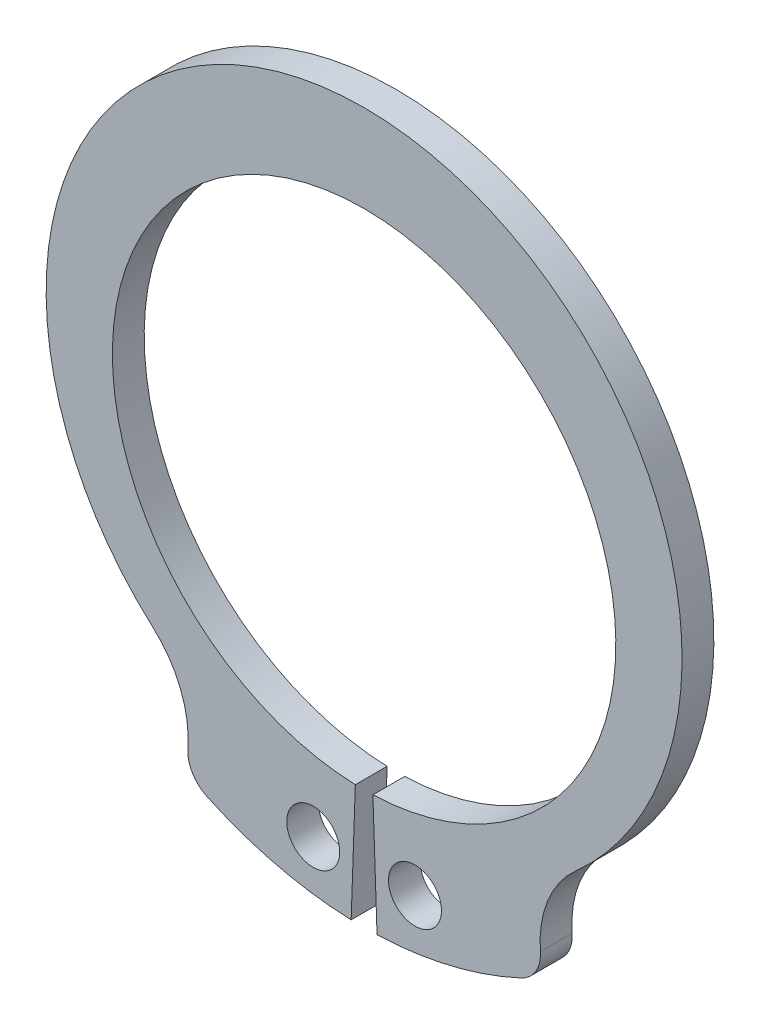
ISO-10303-21;
HEADER;
FILE_DESCRIPTION(('STEP AP214'),'2;1');
FILE_NAME('part.step','',(''),(''),'','','');
FILE_SCHEMA(('AUTOMOTIVE_DESIGN { 1 0 10303 214 1 1 1 1 }'));
ENDSEC;
DATA;
#1=APPLICATION_CONTEXT('core data for automotive mechanical design processes');
#2=APPLICATION_PROTOCOL_DEFINITION('international standard','automotive_design',2000,#1);
#3=PRODUCT_CONTEXT('',#1,'mechanical');
#4=PRODUCT('Part','Part','',(#3));
#5=PRODUCT_RELATED_PRODUCT_CATEGORY('part','',(#4));
#6=PRODUCT_DEFINITION_FORMATION('','',#4);
#7=PRODUCT_DEFINITION_CONTEXT('part definition',#1,'design');
#8=PRODUCT_DEFINITION('design','',#6,#7);
#9=PRODUCT_DEFINITION_SHAPE('','',#8);
#10=(LENGTH_UNIT() NAMED_UNIT(*) SI_UNIT(.MILLI.,.METRE.));
#11=(NAMED_UNIT(*) PLANE_ANGLE_UNIT() SI_UNIT($,.RADIAN.));
#12=(NAMED_UNIT(*) SI_UNIT($,.STERADIAN.) SOLID_ANGLE_UNIT());
#13=UNCERTAINTY_MEASURE_WITH_UNIT(LENGTH_MEASURE(1.E-05),#10,'distance_accuracy_value','');
#14=(GEOMETRIC_REPRESENTATION_CONTEXT(3) GLOBAL_UNCERTAINTY_ASSIGNED_CONTEXT((#13)) GLOBAL_UNIT_ASSIGNED_CONTEXT((#10,
#11,#12)) REPRESENTATION_CONTEXT('',''));
#15=CARTESIAN_POINT('',(0.,0.,0.));
#16=DIRECTION('',(0.,0.,1.));
#17=DIRECTION('',(1.,0.,0.));
#18=AXIS2_PLACEMENT_3D('',#15,#16,#17);
#19=CARTESIAN_POINT('',(10.6411285697582,-11.1484887229254,1.2));
#20=DIRECTION('',(0.,0.,-1.));
#21=DIRECTION('',(-1.,0.,0.));
#22=AXIS2_PLACEMENT_3D('',#19,#20,#21);
#23=CYLINDRICAL_SURFACE('',#22,4.);
#24=CARTESIAN_POINT('',(10.6411285697582,-11.1484887229254,0.));
#25=DIRECTION('',(0.,0.,1.));
#26=DIRECTION('',(1.,0.,0.));
#27=AXIS2_PLACEMENT_3D('',#24,#25,#26);
#28=CIRCLE('',#27,4.);
#29=CARTESIAN_POINT('',(7.98084642731865,-8.16136654219406,0.));
#30=VERTEX_POINT('',#29);
#31=CARTESIAN_POINT('',(6.65267252069166,-11.4521634579043,0.));
#32=VERTEX_POINT('',#31);
#33=EDGE_CURVE('E148',#30,#32,#28,.T.);
#34=ORIENTED_EDGE('',*,*,#33,.F.);
#35=DIRECTION('',(0.,0.,-1.));
#36=VECTOR('',#35,1.);
#37=CARTESIAN_POINT('',(7.98084642731865,-8.16136654219406,1.2));
#38=LINE('',#37,#36);
#39=CARTESIAN_POINT('',(7.98084642731865,-8.16136654219406,1.2));
#40=VERTEX_POINT('',#39);
#41=EDGE_CURVE('E11',#40,#30,#38,.T.);
#42=ORIENTED_EDGE('',*,*,#41,.F.);
#43=CARTESIAN_POINT('',(10.6411285697582,-11.1484887229254,1.2));
#44=DIRECTION('',(0.,0.,1.));
#45=DIRECTION('',(1.,0.,0.));
#46=AXIS2_PLACEMENT_3D('',#43,#44,#45);
#47=CIRCLE('',#46,4.);
#48=CARTESIAN_POINT('',(6.65267252069166,-11.4521634579043,1.2));
#49=VERTEX_POINT('',#48);
#50=EDGE_CURVE('E178',#40,#49,#47,.T.);
#51=ORIENTED_EDGE('',*,*,#50,.T.);
#52=DIRECTION('',(0.,0.,-1.));
#53=VECTOR('',#52,1.);
#54=CARTESIAN_POINT('',(6.65267252069166,-11.4521634579043,1.2));
#55=LINE('',#54,#53);
#56=EDGE_CURVE('E93',#49,#32,#55,.T.);
#57=ORIENTED_EDGE('',*,*,#56,.T.);
#58=EDGE_LOOP('',(#34,#42,#51,#57));
#59=FACE_BOUND('',#58,.T.);
#60=ADVANCED_FACE('F36',(#59),#23,.F.);
#61=CARTESIAN_POINT('',(0.,0.8,1.2));
#62=DIRECTION('',(0.,0.,-1.));
#63=DIRECTION('',(-1.,0.,0.));
#64=AXIS2_PLACEMENT_3D('',#61,#62,#63);
#65=CYLINDRICAL_SURFACE('',#64,12.);
#66=CARTESIAN_POINT('',(0.,0.8,0.));
#67=DIRECTION('',(0.,0.,1.));
#68=DIRECTION('',(1.,0.,0.));
#69=AXIS2_PLACEMENT_3D('',#66,#67,#68);
#70=CIRCLE('',#69,12.);
#71=CARTESIAN_POINT('',(-7.98084642731865,-8.16136654219406,0.));
#72=VERTEX_POINT('',#71);
#73=EDGE_CURVE('E151',#30,#72,#70,.T.);
#74=ORIENTED_EDGE('',*,*,#73,.T.);
#75=DIRECTION('',(0.,0.,-1.));
#76=VECTOR('',#75,1.);
#77=CARTESIAN_POINT('',(-7.98084642731865,-8.16136654219406,1.2));
#78=LINE('',#77,#76);
#79=CARTESIAN_POINT('',(-7.98084642731865,-8.16136654219406,1.2));
#80=VERTEX_POINT('',#79);
#81=EDGE_CURVE('E44',#80,#72,#78,.T.);
#82=ORIENTED_EDGE('',*,*,#81,.F.);
#83=CARTESIAN_POINT('',(0.,0.8,1.2));
#84=DIRECTION('',(0.,0.,1.));
#85=DIRECTION('',(1.,0.,0.));
#86=AXIS2_PLACEMENT_3D('',#83,#84,#85);
#87=CIRCLE('',#86,12.);
#88=EDGE_CURVE('E214',#40,#80,#87,.T.);
#89=ORIENTED_EDGE('',*,*,#88,.F.);
#90=ORIENTED_EDGE('',*,*,#41,.T.);
#91=EDGE_LOOP('',(#74,#82,#89,#90));
#92=FACE_BOUND('',#91,.T.);
#93=ADVANCED_FACE('F227',(#92),#65,.T.);
#94=CARTESIAN_POINT('',(-10.6411285697582,-11.1484887229254,1.2));
#95=DIRECTION('',(0.,0.,-1.));
#96=DIRECTION('',(-1.,0.,0.));
#97=AXIS2_PLACEMENT_3D('',#94,#95,#96);
#98=CYLINDRICAL_SURFACE('',#97,4.);
#99=CARTESIAN_POINT('',(-10.6411285697582,-11.1484887229254,0.));
#100=DIRECTION('',(0.,0.,1.));
#101=DIRECTION('',(1.,0.,0.));
#102=AXIS2_PLACEMENT_3D('',#99,#100,#101);
#103=CIRCLE('',#102,4.);
#104=CARTESIAN_POINT('',(-6.65267252069166,-11.4521634579043,0.));
#105=VERTEX_POINT('',#104);
#106=EDGE_CURVE('E153',#72,#105,#103,.F.);
#107=ORIENTED_EDGE('',*,*,#106,.T.);
#108=DIRECTION('',(0.,0.,-1.));
#109=VECTOR('',#108,1.);
#110=CARTESIAN_POINT('',(-6.65267252069166,-11.4521634579043,1.2));
#111=LINE('',#110,#109);
#112=CARTESIAN_POINT('',(-6.65267252069166,-11.4521634579043,1.2));
#113=VERTEX_POINT('',#112);
#114=EDGE_CURVE('E188',#113,#105,#111,.T.);
#115=ORIENTED_EDGE('',*,*,#114,.F.);
#116=CARTESIAN_POINT('',(-10.6411285697582,-11.1484887229254,1.2));
#117=DIRECTION('',(0.,0.,1.));
#118=DIRECTION('',(1.,0.,0.));
#119=AXIS2_PLACEMENT_3D('',#116,#117,#118);
#120=CIRCLE('',#119,4.);
#121=EDGE_CURVE('E196',#80,#113,#120,.F.);
#122=ORIENTED_EDGE('',*,*,#121,.F.);
#123=ORIENTED_EDGE('',*,*,#81,.T.);
#124=EDGE_LOOP('',(#107,#115,#122,#123));
#125=FACE_BOUND('',#124,.T.);
#126=ADVANCED_FACE('F194',(#125),#98,.F.);
#127=CARTESIAN_POINT('',(-5.40628000535836,-11.5470618125852,1.2));
#128=DIRECTION('',(0.,0.,-1.));
#129=DIRECTION('',(-1.,0.,0.));
#130=AXIS2_PLACEMENT_3D('',#127,#128,#129);
#131=CYLINDRICAL_SURFACE('',#130,1.25);
#132=CARTESIAN_POINT('',(-5.40628000535836,-11.5470618125852,0.));
#133=DIRECTION('',(0.,0.,1.));
#134=DIRECTION('',(1.,0.,0.));
#135=AXIS2_PLACEMENT_3D('',#132,#133,#134);
#136=CIRCLE('',#135,1.25);
#137=CARTESIAN_POINT('',(-5.93630745686408,-12.6791266961719,0.));
#138=VERTEX_POINT('',#137);
#139=EDGE_CURVE('E156',#138,#105,#136,.F.);
#140=ORIENTED_EDGE('',*,*,#139,.F.);
#141=DIRECTION('',(0.,0.,-1.));
#142=VECTOR('',#141,1.);
#143=CARTESIAN_POINT('',(-5.93630745686408,-12.6791266961719,1.2));
#144=LINE('',#143,#142);
#145=CARTESIAN_POINT('',(-5.93630745686408,-12.6791266961719,1.2));
#146=VERTEX_POINT('',#145);
#147=EDGE_CURVE('E186',#146,#138,#144,.T.);
#148=ORIENTED_EDGE('',*,*,#147,.F.);
#149=CARTESIAN_POINT('',(-5.40628000535836,-11.5470618125852,1.2));
#150=DIRECTION('',(0.,0.,1.));
#151=DIRECTION('',(1.,0.,0.));
#152=AXIS2_PLACEMENT_3D('',#149,#150,#151);
#153=CIRCLE('',#152,1.25);
#154=EDGE_CURVE('E209',#146,#113,#153,.F.);
#155=ORIENTED_EDGE('',*,*,#154,.T.);
#156=ORIENTED_EDGE('',*,*,#114,.T.);
#157=EDGE_LOOP('',(#140,#148,#155,#156));
#158=FACE_BOUND('',#157,.T.);
#159=ADVANCED_FACE('F205',(#158),#131,.T.);
#160=CARTESIAN_POINT('',(0.,0.,1.2));
#161=DIRECTION('',(0.,0.,-1.));
#162=DIRECTION('',(-1.,0.,0.));
#163=AXIS2_PLACEMENT_3D('',#160,#161,#162);
#164=CYLINDRICAL_SURFACE('',#163,14.);
#165=CARTESIAN_POINT('',(0.,0.,0.));
#166=DIRECTION('',(0.,0.,1.));
#167=DIRECTION('',(1.,0.,0.));
#168=AXIS2_PLACEMENT_3D('',#165,#166,#167);
#169=CIRCLE('',#168,14.);
#170=CARTESIAN_POINT('',(-0.488592953835013,-13.9914715782673,0.));
#171=VERTEX_POINT('',#170);
#172=EDGE_CURVE('E159',#138,#171,#169,.T.);
#173=ORIENTED_EDGE('',*,*,#172,.T.);
#174=DIRECTION('',(0.,0.,-1.));
#175=VECTOR('',#174,1.);
#176=CARTESIAN_POINT('',(-0.488592953835013,-13.9914715782673,1.2));
#177=LINE('',#176,#175);
#178=CARTESIAN_POINT('',(-0.488592953835013,-13.9914715782673,1.2));
#179=VERTEX_POINT('',#178);
#180=EDGE_CURVE('E184',#179,#171,#177,.T.);
#181=ORIENTED_EDGE('',*,*,#180,.F.);
#182=CARTESIAN_POINT('',(0.,0.,1.2));
#183=DIRECTION('',(0.,0.,1.));
#184=DIRECTION('',(1.,0.,0.));
#185=AXIS2_PLACEMENT_3D('',#182,#183,#184);
#186=CIRCLE('',#185,14.);
#187=EDGE_CURVE('E210',#146,#179,#186,.T.);
#188=ORIENTED_EDGE('',*,*,#187,.F.);
#189=ORIENTED_EDGE('',*,*,#147,.T.);
#190=EDGE_LOOP('',(#173,#181,#188,#189));
#191=FACE_BOUND('',#190,.T.);
#192=ADVANCED_FACE('F237',(#191),#164,.T.);
#193=CARTESIAN_POINT('',(0.,0.,1.2));
#194=DIRECTION('',(0.999390827019096,-0.0348994967025009,0.));
#195=DIRECTION('',(0.0348994967025009,0.999390827019096,0.));
#196=AXIS2_PLACEMENT_3D('',#193,#194,#195);
#197=PLANE('',#196);
#198=DIRECTION('',(-0.0348994967025009,-0.999390827019096,0.));
#199=VECTOR('',#198,1.);
#200=CARTESIAN_POINT('',(0.,0.,0.));
#201=LINE('',#200,#199);
#202=CARTESIAN_POINT('',(-0.331545218673759,-9.49421285668141,0.));
#203=VERTEX_POINT('',#202);
#204=EDGE_CURVE('E162',#203,#171,#201,.T.);
#205=ORIENTED_EDGE('',*,*,#204,.F.);
#206=DIRECTION('',(0.,0.,-1.));
#207=VECTOR('',#206,1.);
#208=CARTESIAN_POINT('',(-0.331545218673759,-9.49421285668141,1.2));
#209=LINE('',#208,#207);
#210=CARTESIAN_POINT('',(-0.331545218673759,-9.49421285668141,1.2));
#211=VERTEX_POINT('',#210);
#212=EDGE_CURVE('E182',#211,#203,#209,.T.);
#213=ORIENTED_EDGE('',*,*,#212,.F.);
#214=DIRECTION('',(-0.0348994967025009,-0.999390827019096,0.));
#215=VECTOR('',#214,1.);
#216=CARTESIAN_POINT('',(0.,0.,1.2));
#217=LINE('',#216,#215);
#218=EDGE_CURVE('E212',#211,#179,#217,.T.);
#219=ORIENTED_EDGE('',*,*,#218,.T.);
#220=ORIENTED_EDGE('',*,*,#180,.T.);
#221=EDGE_LOOP('',(#205,#213,#219,#220));
#222=FACE_BOUND('',#221,.T.);
#223=ADVANCED_FACE('F240',(#222),#197,.T.);
#224=CARTESIAN_POINT('',(0.,0.,1.2));
#225=DIRECTION('',(0.,0.,-1.));
#226=DIRECTION('',(-1.,0.,0.));
#227=AXIS2_PLACEMENT_3D('',#224,#225,#226);
#228=CYLINDRICAL_SURFACE('',#227,9.5);
#229=CARTESIAN_POINT('',(0.,0.,0.));
#230=DIRECTION('',(0.,0.,1.));
#231=DIRECTION('',(1.,0.,0.));
#232=AXIS2_PLACEMENT_3D('',#229,#230,#231);
#233=CIRCLE('',#232,9.5);
#234=CARTESIAN_POINT('',(0.331545218673761,-9.49421285668141,0.));
#235=VERTEX_POINT('',#234);
#236=EDGE_CURVE('E165',#235,#203,#233,.T.);
#237=ORIENTED_EDGE('',*,*,#236,.F.);
#238=DIRECTION('',(0.,0.,-1.));
#239=VECTOR('',#238,1.);
#240=CARTESIAN_POINT('',(0.331545218673761,-9.49421285668141,1.2));
#241=LINE('',#240,#239);
#242=CARTESIAN_POINT('',(0.331545218673761,-9.49421285668141,1.2));
#243=VERTEX_POINT('',#242);
#244=EDGE_CURVE('E134',#243,#235,#241,.T.);
#245=ORIENTED_EDGE('',*,*,#244,.F.);
#246=CARTESIAN_POINT('',(0.,0.,1.2));
#247=DIRECTION('',(0.,0.,1.));
#248=DIRECTION('',(1.,0.,0.));
#249=AXIS2_PLACEMENT_3D('',#246,#247,#248);
#250=CIRCLE('',#249,9.5);
#251=EDGE_CURVE('E127',#243,#211,#250,.T.);
#252=ORIENTED_EDGE('',*,*,#251,.T.);
#253=ORIENTED_EDGE('',*,*,#212,.T.);
#254=EDGE_LOOP('',(#237,#245,#252,#253));
#255=FACE_BOUND('',#254,.T.);
#256=ADVANCED_FACE('F221',(#255),#228,.F.);
#257=CARTESIAN_POINT('',(0.,0.,1.2));
#258=DIRECTION('',(0.999390827019096,0.0348994967025012,0.));
#259=DIRECTION('',(-0.0348994967025012,0.999390827019096,0.));
#260=AXIS2_PLACEMENT_3D('',#257,#258,#259);
#261=PLANE('',#260);
#262=DIRECTION('',(0.0348994967025012,-0.999390827019096,0.));
#263=VECTOR('',#262,1.);
#264=CARTESIAN_POINT('',(0.,0.,0.));
#265=LINE('',#264,#263);
#266=CARTESIAN_POINT('',(0.488592953835016,-13.9914715782673,0.));
#267=VERTEX_POINT('',#266);
#268=EDGE_CURVE('E133',#235,#267,#265,.T.);
#269=ORIENTED_EDGE('',*,*,#268,.T.);
#270=DIRECTION('',(0.,0.,-1.));
#271=VECTOR('',#270,1.);
#272=CARTESIAN_POINT('',(0.488592953835016,-13.9914715782673,1.2));
#273=LINE('',#272,#271);
#274=CARTESIAN_POINT('',(0.488592953835016,-13.9914715782673,1.2));
#275=VERTEX_POINT('',#274);
#276=EDGE_CURVE('E130',#275,#267,#273,.T.);
#277=ORIENTED_EDGE('',*,*,#276,.F.);
#278=DIRECTION('',(0.0348994967025012,-0.999390827019096,0.));
#279=VECTOR('',#278,1.);
#280=CARTESIAN_POINT('',(0.,0.,1.2));
#281=LINE('',#280,#279);
#282=EDGE_CURVE('E119',#243,#275,#281,.T.);
#283=ORIENTED_EDGE('',*,*,#282,.F.);
#284=ORIENTED_EDGE('',*,*,#244,.T.);
#285=EDGE_LOOP('',(#269,#277,#283,#284));
#286=FACE_BOUND('',#285,.T.);
#287=ADVANCED_FACE('F131',(#286),#261,.F.);
#288=CARTESIAN_POINT('',(0.,0.,1.2));
#289=DIRECTION('',(0.,0.,-1.));
#290=DIRECTION('',(-1.,0.,0.));
#291=AXIS2_PLACEMENT_3D('',#288,#289,#290);
#292=CYLINDRICAL_SURFACE('',#291,14.);
#293=CARTESIAN_POINT('',(0.,0.,0.));
#294=DIRECTION('',(0.,0.,1.));
#295=DIRECTION('',(1.,0.,0.));
#296=AXIS2_PLACEMENT_3D('',#293,#294,#295);
#297=CIRCLE('',#296,14.);
#298=CARTESIAN_POINT('',(5.93630745686408,-12.6791266961719,0.));
#299=VERTEX_POINT('',#298);
#300=EDGE_CURVE('E86',#267,#299,#297,.T.);
#301=ORIENTED_EDGE('',*,*,#300,.T.);
#302=DIRECTION('',(0.,0.,-1.));
#303=VECTOR('',#302,1.);
#304=CARTESIAN_POINT('',(5.93630745686408,-12.6791266961719,1.2));
#305=LINE('',#304,#303);
#306=CARTESIAN_POINT('',(5.93630745686408,-12.6791266961719,1.2));
#307=VERTEX_POINT('',#306);
#308=EDGE_CURVE('E135',#307,#299,#305,.T.);
#309=ORIENTED_EDGE('',*,*,#308,.F.);
#310=CARTESIAN_POINT('',(0.,0.,1.2));
#311=DIRECTION('',(0.,0.,1.));
#312=DIRECTION('',(1.,0.,0.));
#313=AXIS2_PLACEMENT_3D('',#310,#311,#312);
#314=CIRCLE('',#313,14.);
#315=EDGE_CURVE('E124',#275,#307,#314,.T.);
#316=ORIENTED_EDGE('',*,*,#315,.F.);
#317=ORIENTED_EDGE('',*,*,#276,.T.);
#318=EDGE_LOOP('',(#301,#309,#316,#317));
#319=FACE_BOUND('',#318,.T.);
#320=ADVANCED_FACE('F137',(#319),#292,.T.);
#321=CARTESIAN_POINT('',(-1.91966573129975,-11.9914715782673,1.2));
#322=DIRECTION('',(0.,0.,-1.));
#323=DIRECTION('',(-1.,0.,0.));
#324=AXIS2_PLACEMENT_3D('',#321,#322,#323);
#325=CYLINDRICAL_SURFACE('',#324,1.);
#326=CARTESIAN_POINT('',(-1.91966573129975,-11.9914715782673,1.2));
#327=DIRECTION('',(0.,0.,1.));
#328=DIRECTION('',(1.,0.,0.));
#329=AXIS2_PLACEMENT_3D('',#326,#327,#328);
#330=CIRCLE('',#329,1.);
#331=CARTESIAN_POINT('',(-0.919665731299753,-11.9914715782673,1.2));
#332=VERTEX_POINT('',#331);
#333=EDGE_CURVE('E139',#332,#332,#330,.F.);
#334=ORIENTED_EDGE('',*,*,#333,.F.);
#335=EDGE_LOOP('',(#334));
#336=FACE_BOUND('',#335,.T.);
#337=CARTESIAN_POINT('',(-1.91966573129975,-11.9914715782673,0.));
#338=DIRECTION('',(0.,0.,1.));
#339=DIRECTION('',(1.,0.,0.));
#340=AXIS2_PLACEMENT_3D('',#337,#338,#339);
#341=CIRCLE('',#340,1.);
#342=CARTESIAN_POINT('',(-0.919665731299753,-11.9914715782673,0.));
#343=VERTEX_POINT('',#342);
#344=EDGE_CURVE('E172',#343,#343,#341,.F.);
#345=ORIENTED_EDGE('',*,*,#344,.T.);
#346=EDGE_LOOP('',(#345));
#347=FACE_BOUND('',#346,.T.);
#348=ADVANCED_FACE('F251',(#336,#347),#325,.F.);
#349=CARTESIAN_POINT('',(5.40628000535836,-11.5470618125852,1.2));
#350=DIRECTION('',(0.,0.,-1.));
#351=DIRECTION('',(-1.,0.,0.));
#352=AXIS2_PLACEMENT_3D('',#349,#350,#351);
#353=CYLINDRICAL_SURFACE('',#352,1.25);
#354=CARTESIAN_POINT('',(5.40628000535836,-11.5470618125852,0.));
#355=DIRECTION('',(0.,0.,1.));
#356=DIRECTION('',(1.,0.,0.));
#357=AXIS2_PLACEMENT_3D('',#354,#355,#356);
#358=CIRCLE('',#357,1.25);
#359=EDGE_CURVE('E170',#299,#32,#358,.T.);
#360=ORIENTED_EDGE('',*,*,#359,.T.);
#361=ORIENTED_EDGE('',*,*,#56,.F.);
#362=CARTESIAN_POINT('',(5.40628000535836,-11.5470618125852,1.2));
#363=DIRECTION('',(0.,0.,1.));
#364=DIRECTION('',(1.,0.,0.));
#365=AXIS2_PLACEMENT_3D('',#362,#363,#364);
#366=CIRCLE('',#365,1.25);
#367=EDGE_CURVE('E52',#307,#49,#366,.T.);
#368=ORIENTED_EDGE('',*,*,#367,.F.);
#369=ORIENTED_EDGE('',*,*,#308,.T.);
#370=EDGE_LOOP('',(#360,#361,#368,#369));
#371=FACE_BOUND('',#370,.T.);
#372=ADVANCED_FACE('F225',(#371),#353,.T.);
#373=CARTESIAN_POINT('',(1.91966573129975,-11.9914715782673,1.2));
#374=DIRECTION('',(0.,0.,-1.));
#375=DIRECTION('',(-1.,0.,0.));
#376=AXIS2_PLACEMENT_3D('',#373,#374,#375);
#377=CYLINDRICAL_SURFACE('',#376,1.);
#378=CARTESIAN_POINT('',(1.91966573129975,-11.9914715782673,1.2));
#379=DIRECTION('',(0.,0.,1.));
#380=DIRECTION('',(1.,0.,0.));
#381=AXIS2_PLACEMENT_3D('',#378,#379,#380);
#382=CIRCLE('',#381,1.);
#383=CARTESIAN_POINT('',(2.91966573129975,-11.9914715782673,1.2));
#384=VERTEX_POINT('',#383);
#385=EDGE_CURVE('E145',#384,#384,#382,.T.);
#386=ORIENTED_EDGE('',*,*,#385,.T.);
#387=EDGE_LOOP('',(#386));
#388=FACE_BOUND('',#387,.T.);
#389=CARTESIAN_POINT('',(1.91966573129975,-11.9914715782673,0.));
#390=DIRECTION('',(0.,0.,1.));
#391=DIRECTION('',(1.,0.,0.));
#392=AXIS2_PLACEMENT_3D('',#389,#390,#391);
#393=CIRCLE('',#392,1.);
#394=CARTESIAN_POINT('',(2.91966573129975,-11.9914715782673,0.));
#395=VERTEX_POINT('',#394);
#396=EDGE_CURVE('E175',#395,#395,#393,.T.);
#397=ORIENTED_EDGE('',*,*,#396,.F.);
#398=EDGE_LOOP('',(#397));
#399=FACE_BOUND('',#398,.T.);
#400=ADVANCED_FACE('F254',(#388,#399),#377,.F.);
#401=CARTESIAN_POINT('',(0.,0.,1.2));
#402=DIRECTION('',(0.,0.,1.));
#403=DIRECTION('',(1.,0.,0.));
#404=AXIS2_PLACEMENT_3D('',#401,#402,#403);
#405=PLANE('',#404);
#406=ORIENTED_EDGE('',*,*,#50,.F.);
#407=ORIENTED_EDGE('',*,*,#88,.T.);
#408=ORIENTED_EDGE('',*,*,#121,.T.);
#409=ORIENTED_EDGE('',*,*,#154,.F.);
#410=ORIENTED_EDGE('',*,*,#187,.T.);
#411=ORIENTED_EDGE('',*,*,#218,.F.);
#412=ORIENTED_EDGE('',*,*,#251,.F.);
#413=ORIENTED_EDGE('',*,*,#282,.T.);
#414=ORIENTED_EDGE('',*,*,#315,.T.);
#415=ORIENTED_EDGE('',*,*,#367,.T.);
#416=EDGE_LOOP('',(#406,#407,#408,#409,#410,#411,#412,#413,#414,#415));
#417=FACE_BOUND('',#416,.T.);
#418=ORIENTED_EDGE('',*,*,#333,.T.);
#419=EDGE_LOOP('',(#418));
#420=FACE_BOUND('',#419,.T.);
#421=ORIENTED_EDGE('',*,*,#385,.F.);
#422=EDGE_LOOP('',(#421));
#423=FACE_BOUND('',#422,.T.);
#424=ADVANCED_FACE('F121',(#417,#420,#423),#405,.T.);
#425=CARTESIAN_POINT('',(0.,0.,0.));
#426=DIRECTION('',(0.,0.,1.));
#427=DIRECTION('',(1.,0.,0.));
#428=AXIS2_PLACEMENT_3D('',#425,#426,#427);
#429=PLANE('',#428);
#430=ORIENTED_EDGE('',*,*,#33,.T.);
#431=ORIENTED_EDGE('',*,*,#359,.F.);
#432=ORIENTED_EDGE('',*,*,#300,.F.);
#433=ORIENTED_EDGE('',*,*,#268,.F.);
#434=ORIENTED_EDGE('',*,*,#236,.T.);
#435=ORIENTED_EDGE('',*,*,#204,.T.);
#436=ORIENTED_EDGE('',*,*,#172,.F.);
#437=ORIENTED_EDGE('',*,*,#139,.T.);
#438=ORIENTED_EDGE('',*,*,#106,.F.);
#439=ORIENTED_EDGE('',*,*,#73,.F.);
#440=EDGE_LOOP('',(#430,#431,#432,#433,#434,#435,#436,#437,#438,#439));
#441=FACE_BOUND('',#440,.T.);
#442=ORIENTED_EDGE('',*,*,#344,.F.);
#443=EDGE_LOOP('',(#442));
#444=FACE_BOUND('',#443,.T.);
#445=ORIENTED_EDGE('',*,*,#396,.T.);
#446=EDGE_LOOP('',(#445));
#447=FACE_BOUND('',#446,.T.);
#448=ADVANCED_FACE('F200',(#441,#444,#447),#429,.F.);
#449=CLOSED_SHELL('',(#60,#93,#126,#159,#192,#223,#256,#287,#320,#348,#372,#400,#424,#448));
#450=MANIFOLD_SOLID_BREP('B2',#449);
#451=ADVANCED_BREP_SHAPE_REPRESENTATION('',(#18,#450),#14);
#452=SHAPE_DEFINITION_REPRESENTATION(#9,#451);
ENDSEC;
END-ISO-10303-21;
